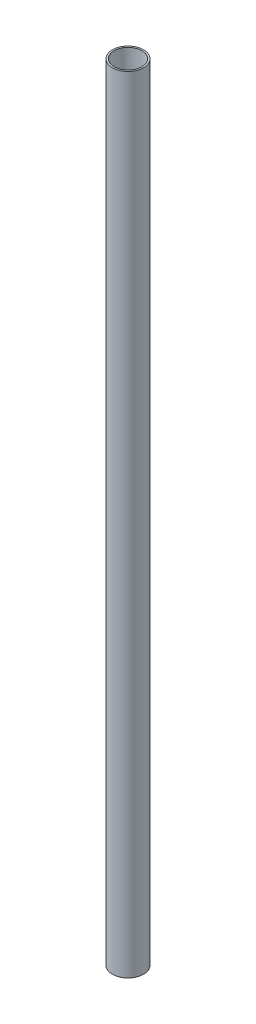
ISO-10303-21;
HEADER;
FILE_DESCRIPTION(('STEP AP214'),'2;1');
FILE_NAME('part.step','',(''),(''),'','','');
FILE_SCHEMA(('AUTOMOTIVE_DESIGN { 1 0 10303 214 1 1 1 1 }'));
ENDSEC;
DATA;
#1=APPLICATION_CONTEXT('core data for automotive mechanical design processes');
#2=APPLICATION_PROTOCOL_DEFINITION('international standard','automotive_design',2000,#1);
#3=PRODUCT_CONTEXT('',#1,'mechanical');
#4=PRODUCT('Part','Part','',(#3));
#5=PRODUCT_RELATED_PRODUCT_CATEGORY('part','',(#4));
#6=PRODUCT_DEFINITION_FORMATION('','',#4);
#7=PRODUCT_DEFINITION_CONTEXT('part definition',#1,'design');
#8=PRODUCT_DEFINITION('design','',#6,#7);
#9=PRODUCT_DEFINITION_SHAPE('','',#8);
#10=(LENGTH_UNIT() NAMED_UNIT(*) SI_UNIT(.MILLI.,.METRE.));
#11=(NAMED_UNIT(*) PLANE_ANGLE_UNIT() SI_UNIT($,.RADIAN.));
#12=(NAMED_UNIT(*) SI_UNIT($,.STERADIAN.) SOLID_ANGLE_UNIT());
#13=UNCERTAINTY_MEASURE_WITH_UNIT(LENGTH_MEASURE(1.E-05),#10,'distance_accuracy_value','');
#14=(GEOMETRIC_REPRESENTATION_CONTEXT(3) GLOBAL_UNCERTAINTY_ASSIGNED_CONTEXT((#13)) GLOBAL_UNIT_ASSIGNED_CONTEXT((#10,
#11,#12)) REPRESENTATION_CONTEXT('',''));
#15=CARTESIAN_POINT('',(0.,0.,0.));
#16=DIRECTION('',(0.,0.,1.));
#17=DIRECTION('',(1.,0.,0.));
#18=AXIS2_PLACEMENT_3D('',#15,#16,#17);
#19=CARTESIAN_POINT('',(0.,1524.,0.));
#20=DIRECTION('',(0.,1.,0.));
#21=DIRECTION('',(0.,0.,1.));
#22=AXIS2_PLACEMENT_3D('',#19,#20,#21);
#23=PLANE('',#22);
#24=CARTESIAN_POINT('',(0.,1524.,0.));
#25=DIRECTION('',(0.,1.,0.));
#26=DIRECTION('',(0.,0.,1.));
#27=AXIS2_PLACEMENT_3D('',#24,#25,#26);
#28=CIRCLE('',#27,30.226);
#29=CARTESIAN_POINT('',(0.,1524.,30.226));
#30=VERTEX_POINT('',#29);
#31=EDGE_CURVE('E10',#30,#30,#28,.T.);
#32=ORIENTED_EDGE('',*,*,#31,.T.);
#33=EDGE_LOOP('',(#32));
#34=FACE_BOUND('',#33,.T.);
#35=CARTESIAN_POINT('',(0.,1524.,0.));
#36=DIRECTION('',(0.,1.,0.));
#37=DIRECTION('',(0.,0.,1.));
#38=AXIS2_PLACEMENT_3D('',#35,#36,#37);
#39=CIRCLE('',#38,27.051);
#40=CARTESIAN_POINT('',(0.,1524.,27.051));
#41=VERTEX_POINT('',#40);
#42=EDGE_CURVE('E42',#41,#41,#39,.T.);
#43=ORIENTED_EDGE('',*,*,#42,.F.);
#44=EDGE_LOOP('',(#43));
#45=FACE_BOUND('',#44,.T.);
#46=ADVANCED_FACE('F31',(#34,#45),#23,.T.);
#47=CARTESIAN_POINT('',(0.,0.,0.));
#48=DIRECTION('',(0.,1.,0.));
#49=DIRECTION('',(0.,0.,1.));
#50=AXIS2_PLACEMENT_3D('',#47,#48,#49);
#51=PLANE('',#50);
#52=CARTESIAN_POINT('',(0.,0.,0.));
#53=DIRECTION('',(0.,1.,0.));
#54=DIRECTION('',(0.,0.,1.));
#55=AXIS2_PLACEMENT_3D('',#52,#53,#54);
#56=CIRCLE('',#55,30.226);
#57=CARTESIAN_POINT('',(0.,0.,30.226));
#58=VERTEX_POINT('',#57);
#59=EDGE_CURVE('E35',#58,#58,#56,.T.);
#60=ORIENTED_EDGE('',*,*,#59,.F.);
#61=EDGE_LOOP('',(#60));
#62=FACE_BOUND('',#61,.T.);
#63=CARTESIAN_POINT('',(0.,0.,0.));
#64=DIRECTION('',(0.,1.,0.));
#65=DIRECTION('',(0.,0.,1.));
#66=AXIS2_PLACEMENT_3D('',#63,#64,#65);
#67=CIRCLE('',#66,27.051);
#68=CARTESIAN_POINT('',(0.,0.,27.051));
#69=VERTEX_POINT('',#68);
#70=EDGE_CURVE('E44',#69,#69,#67,.T.);
#71=ORIENTED_EDGE('',*,*,#70,.T.);
#72=EDGE_LOOP('',(#71));
#73=FACE_BOUND('',#72,.T.);
#74=ADVANCED_FACE('F54',(#62,#73),#51,.F.);
#75=CARTESIAN_POINT('',(0.,1524.,0.));
#76=DIRECTION('',(0.,-1.,0.));
#77=DIRECTION('',(0.,0.,-1.));
#78=AXIS2_PLACEMENT_3D('',#75,#76,#77);
#79=CYLINDRICAL_SURFACE('',#78,30.226);
#80=ORIENTED_EDGE('',*,*,#31,.F.);
#81=EDGE_LOOP('',(#80));
#82=FACE_BOUND('',#81,.T.);
#83=ORIENTED_EDGE('',*,*,#59,.T.);
#84=EDGE_LOOP('',(#83));
#85=FACE_BOUND('',#84,.T.);
#86=ADVANCED_FACE('F33',(#82,#85),#79,.T.);
#87=CARTESIAN_POINT('',(0.,1524.,0.));
#88=DIRECTION('',(0.,-1.,0.));
#89=DIRECTION('',(0.,0.,-1.));
#90=AXIS2_PLACEMENT_3D('',#87,#88,#89);
#91=CYLINDRICAL_SURFACE('',#90,27.051);
#92=ORIENTED_EDGE('',*,*,#42,.T.);
#93=EDGE_LOOP('',(#92));
#94=FACE_BOUND('',#93,.T.);
#95=ORIENTED_EDGE('',*,*,#70,.F.);
#96=EDGE_LOOP('',(#95));
#97=FACE_BOUND('',#96,.T.);
#98=ADVANCED_FACE('F50',(#94,#97),#91,.F.);
#99=CLOSED_SHELL('',(#46,#74,#86,#98));
#100=MANIFOLD_SOLID_BREP('B2',#99);
#101=ADVANCED_BREP_SHAPE_REPRESENTATION('',(#18,#100),#14);
#102=SHAPE_DEFINITION_REPRESENTATION(#9,#101);
ENDSEC;
END-ISO-10303-21;
